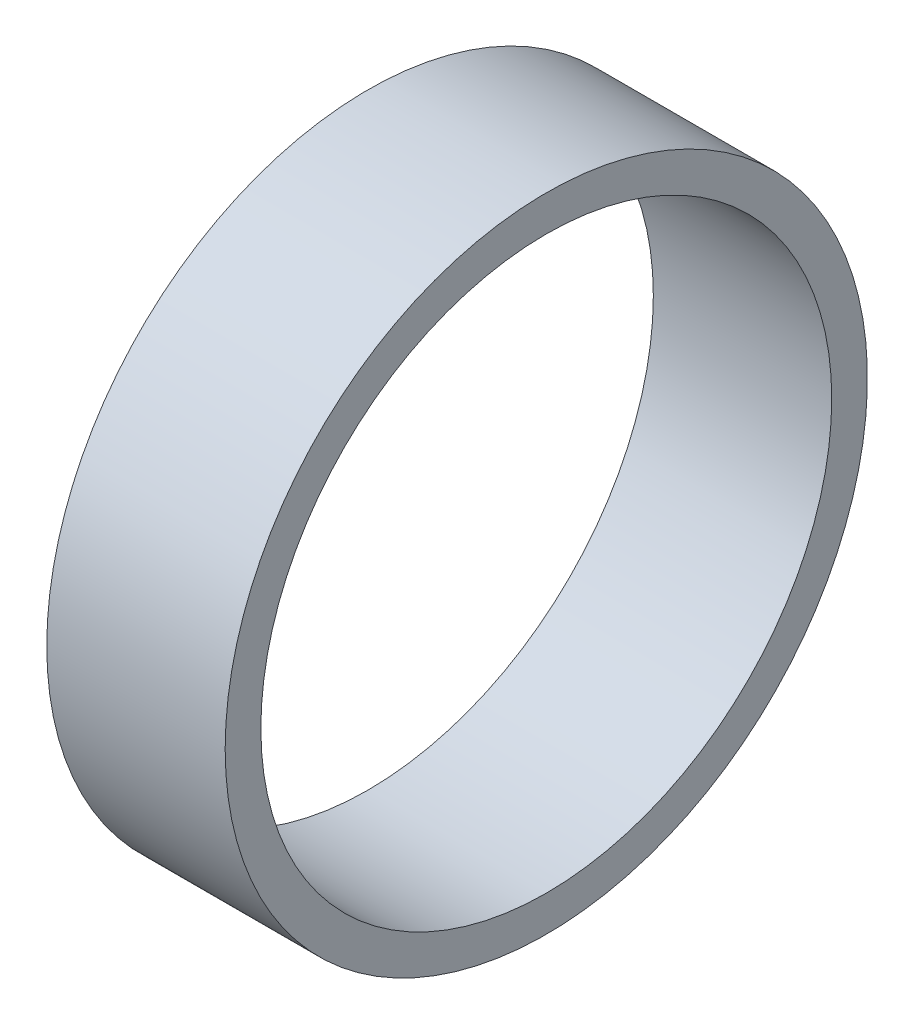
ISO-10303-21;
HEADER;
FILE_DESCRIPTION(('STEP AP214'),'2;1');
FILE_NAME('part.step','',(''),(''),'','','');
FILE_SCHEMA(('AUTOMOTIVE_DESIGN { 1 0 10303 214 1 1 1 1 }'));
ENDSEC;
DATA;
#1=APPLICATION_CONTEXT('core data for automotive mechanical design processes');
#2=APPLICATION_PROTOCOL_DEFINITION('international standard','automotive_design',2000,#1);
#3=PRODUCT_CONTEXT('',#1,'mechanical');
#4=PRODUCT('Part','Part','',(#3));
#5=PRODUCT_RELATED_PRODUCT_CATEGORY('part','',(#4));
#6=PRODUCT_DEFINITION_FORMATION('','',#4);
#7=PRODUCT_DEFINITION_CONTEXT('part definition',#1,'design');
#8=PRODUCT_DEFINITION('design','',#6,#7);
#9=PRODUCT_DEFINITION_SHAPE('','',#8);
#10=(LENGTH_UNIT() NAMED_UNIT(*) SI_UNIT(.MILLI.,.METRE.));
#11=(NAMED_UNIT(*) PLANE_ANGLE_UNIT() SI_UNIT($,.RADIAN.));
#12=(NAMED_UNIT(*) SI_UNIT($,.STERADIAN.) SOLID_ANGLE_UNIT());
#13=UNCERTAINTY_MEASURE_WITH_UNIT(LENGTH_MEASURE(1.E-05),#10,'distance_accuracy_value','');
#14=(GEOMETRIC_REPRESENTATION_CONTEXT(3) GLOBAL_UNCERTAINTY_ASSIGNED_CONTEXT((#13)) GLOBAL_UNIT_ASSIGNED_CONTEXT((#10,
#11,#12)) REPRESENTATION_CONTEXT('',''));
#15=CARTESIAN_POINT('',(0.,0.,0.));
#16=DIRECTION('',(0.,0.,1.));
#17=DIRECTION('',(1.,0.,0.));
#18=AXIS2_PLACEMENT_3D('',#15,#16,#17);
#19=CARTESIAN_POINT('',(0.,0.,-18.));
#20=DIRECTION('',(1.,0.,0.));
#21=DIRECTION('',(0.,0.,-1.));
#22=AXIS2_PLACEMENT_3D('',#19,#20,#21);
#23=PLANE('',#22);
#24=CARTESIAN_POINT('',(0.,0.,0.));
#25=DIRECTION('',(-1.,0.,0.));
#26=DIRECTION('',(0.,0.,1.));
#27=AXIS2_PLACEMENT_3D('',#24,#25,#26);
#28=CIRCLE('',#27,16.);
#29=CARTESIAN_POINT('',(0.,0.,16.));
#30=VERTEX_POINT('',#29);
#31=EDGE_CURVE('E10',#30,#30,#28,.T.);
#32=ORIENTED_EDGE('',*,*,#31,.F.);
#33=EDGE_LOOP('',(#32));
#34=FACE_BOUND('',#33,.T.);
#35=CARTESIAN_POINT('',(0.,0.,0.));
#36=DIRECTION('',(-1.,0.,0.));
#37=DIRECTION('',(0.,0.,1.));
#38=AXIS2_PLACEMENT_3D('',#35,#36,#37);
#39=CIRCLE('',#38,18.);
#40=CARTESIAN_POINT('',(0.,0.,18.));
#41=VERTEX_POINT('',#40);
#42=EDGE_CURVE('E60',#41,#41,#39,.T.);
#43=ORIENTED_EDGE('',*,*,#42,.T.);
#44=EDGE_LOOP('',(#43));
#45=FACE_BOUND('',#44,.T.);
#46=ADVANCED_FACE('F43',(#34,#45),#23,.F.);
#47=CARTESIAN_POINT('',(0.,0.,0.));
#48=DIRECTION('',(-1.,0.,0.));
#49=DIRECTION('',(0.,0.,1.));
#50=AXIS2_PLACEMENT_3D('',#47,#48,#49);
#51=CYLINDRICAL_SURFACE('',#50,16.);
#52=CARTESIAN_POINT('',(10.,0.,0.));
#53=DIRECTION('',(-1.,0.,0.));
#54=DIRECTION('',(0.,0.,1.));
#55=AXIS2_PLACEMENT_3D('',#52,#53,#54);
#56=CIRCLE('',#55,16.);
#57=CARTESIAN_POINT('',(10.,0.,16.));
#58=VERTEX_POINT('',#57);
#59=EDGE_CURVE('E50',#58,#58,#56,.T.);
#60=ORIENTED_EDGE('',*,*,#59,.F.);
#61=EDGE_LOOP('',(#60));
#62=FACE_BOUND('',#61,.T.);
#63=ORIENTED_EDGE('',*,*,#31,.T.);
#64=EDGE_LOOP('',(#63));
#65=FACE_BOUND('',#64,.T.);
#66=ADVANCED_FACE('F76',(#62,#65),#51,.F.);
#67=CARTESIAN_POINT('',(10.,0.,-16.));
#68=DIRECTION('',(-1.,0.,0.));
#69=DIRECTION('',(0.,0.,1.));
#70=AXIS2_PLACEMENT_3D('',#67,#68,#69);
#71=PLANE('',#70);
#72=CARTESIAN_POINT('',(10.,0.,0.));
#73=DIRECTION('',(-1.,0.,0.));
#74=DIRECTION('',(0.,0.,1.));
#75=AXIS2_PLACEMENT_3D('',#72,#73,#74);
#76=CIRCLE('',#75,18.);
#77=CARTESIAN_POINT('',(10.,0.,18.));
#78=VERTEX_POINT('',#77);
#79=EDGE_CURVE('E55',#78,#78,#76,.T.);
#80=ORIENTED_EDGE('',*,*,#79,.F.);
#81=EDGE_LOOP('',(#80));
#82=FACE_BOUND('',#81,.T.);
#83=ORIENTED_EDGE('',*,*,#59,.T.);
#84=EDGE_LOOP('',(#83));
#85=FACE_BOUND('',#84,.T.);
#86=ADVANCED_FACE('F71',(#82,#85),#71,.F.);
#87=CARTESIAN_POINT('',(0.,0.,0.));
#88=DIRECTION('',(-1.,0.,0.));
#89=DIRECTION('',(0.,0.,1.));
#90=AXIS2_PLACEMENT_3D('',#87,#88,#89);
#91=CYLINDRICAL_SURFACE('',#90,18.);
#92=ORIENTED_EDGE('',*,*,#42,.F.);
#93=EDGE_LOOP('',(#92));
#94=FACE_BOUND('',#93,.T.);
#95=ORIENTED_EDGE('',*,*,#79,.T.);
#96=EDGE_LOOP('',(#95));
#97=FACE_BOUND('',#96,.T.);
#98=ADVANCED_FACE('F68',(#94,#97),#91,.T.);
#99=CLOSED_SHELL('',(#46,#66,#86,#98));
#100=MANIFOLD_SOLID_BREP('B2',#99);
#101=ADVANCED_BREP_SHAPE_REPRESENTATION('',(#18,#100),#14);
#102=SHAPE_DEFINITION_REPRESENTATION(#9,#101);
ENDSEC;
END-ISO-10303-21;
